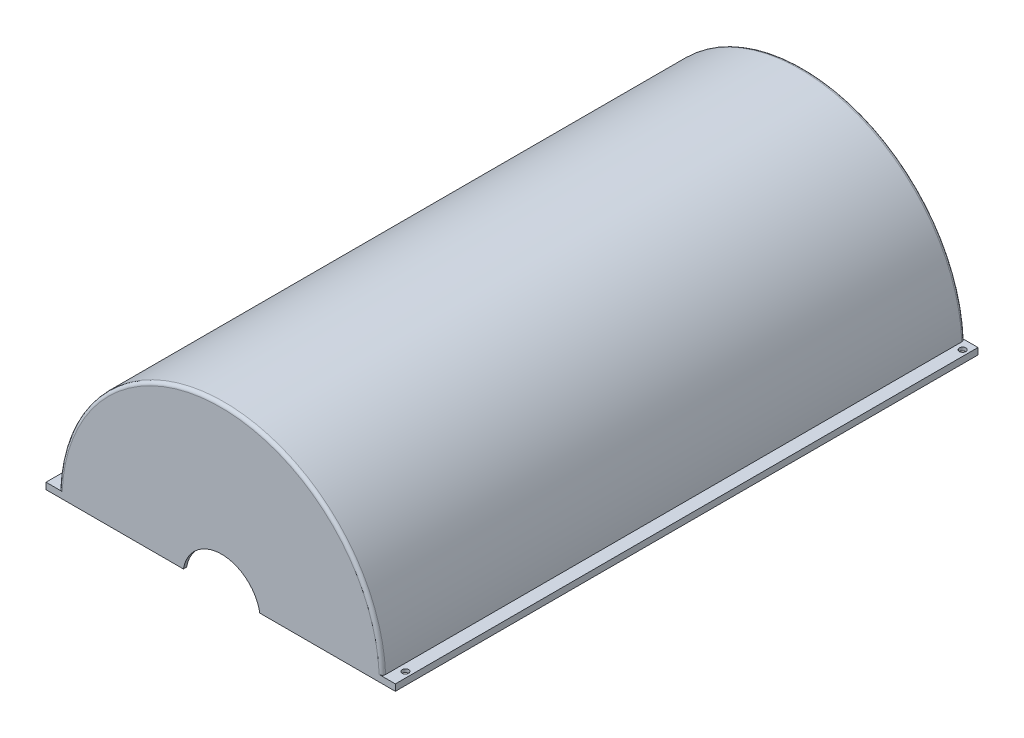
ISO-10303-21;
HEADER;
FILE_DESCRIPTION(('STEP AP214'),'2;1');
FILE_NAME('part.step','',(''),(''),'','','');
FILE_SCHEMA(('AUTOMOTIVE_DESIGN { 1 0 10303 214 1 1 1 1 }'));
ENDSEC;
DATA;
#1=APPLICATION_CONTEXT('core data for automotive mechanical design processes');
#2=APPLICATION_PROTOCOL_DEFINITION('international standard','automotive_design',2000,#1);
#3=PRODUCT_CONTEXT('',#1,'mechanical');
#4=PRODUCT('Part','Part','',(#3));
#5=PRODUCT_RELATED_PRODUCT_CATEGORY('part','',(#4));
#6=PRODUCT_DEFINITION_FORMATION('','',#4);
#7=PRODUCT_DEFINITION_CONTEXT('part definition',#1,'design');
#8=PRODUCT_DEFINITION('design','',#6,#7);
#9=PRODUCT_DEFINITION_SHAPE('','',#8);
#10=(LENGTH_UNIT() NAMED_UNIT(*) SI_UNIT(.MILLI.,.METRE.));
#11=(NAMED_UNIT(*) PLANE_ANGLE_UNIT() SI_UNIT($,.RADIAN.));
#12=(NAMED_UNIT(*) SI_UNIT($,.STERADIAN.) SOLID_ANGLE_UNIT());
#13=UNCERTAINTY_MEASURE_WITH_UNIT(LENGTH_MEASURE(1.E-05),#10,'distance_accuracy_value','');
#14=(GEOMETRIC_REPRESENTATION_CONTEXT(3) GLOBAL_UNCERTAINTY_ASSIGNED_CONTEXT((#13)) GLOBAL_UNIT_ASSIGNED_CONTEXT((#10,
#11,#12)) REPRESENTATION_CONTEXT('',''));
#15=CARTESIAN_POINT('',(0.,0.,0.));
#16=DIRECTION('',(0.,0.,1.));
#17=DIRECTION('',(1.,0.,0.));
#18=AXIS2_PLACEMENT_3D('',#15,#16,#17);
#19=CARTESIAN_POINT('',(1029.59983987187,0.,1800.));
#20=DIRECTION('',(-1.,0.,0.));
#21=DIRECTION('',(0.,0.,1.));
#22=AXIS2_PLACEMENT_3D('',#19,#20,#21);
#23=PLANE('',#22);
#24=DIRECTION('',(0.,1.,0.));
#25=VECTOR('',#24,1.);
#26=CARTESIAN_POINT('',(1029.59983987187,0.,35.9692352263382));
#27=LINE('',#26,#25);
#28=CARTESIAN_POINT('',(1029.59983987187,0.,35.9692352263382));
#29=VERTEX_POINT('',#28);
#30=CARTESIAN_POINT('',(1029.59983987187,10.,35.9692352263382));
#31=VERTEX_POINT('',#30);
#32=EDGE_CURVE('E47',#29,#31,#27,.T.);
#33=ORIENTED_EDGE('',*,*,#32,.F.);
#34=DIRECTION('',(0.,0.,-1.));
#35=VECTOR('',#34,1.);
#36=CARTESIAN_POINT('',(1029.59983987187,0.,1800.));
#37=LINE('',#36,#35);
#38=CARTESIAN_POINT('',(1029.59983987187,0.,1744.92903601317));
#39=VERTEX_POINT('',#38);
#40=EDGE_CURVE('E217',#39,#29,#37,.T.);
#41=ORIENTED_EDGE('',*,*,#40,.F.);
#42=DIRECTION('',(0.,1.,0.));
#43=VECTOR('',#42,1.);
#44=CARTESIAN_POINT('',(1029.59983987187,0.,1744.92903601317));
#45=LINE('',#44,#43);
#46=CARTESIAN_POINT('',(1029.59983987187,10.,1744.92903601317));
#47=VERTEX_POINT('',#46);
#48=EDGE_CURVE('E195',#47,#39,#45,.F.);
#49=ORIENTED_EDGE('',*,*,#48,.F.);
#50=DIRECTION('',(0.,0.,-1.));
#51=VECTOR('',#50,1.);
#52=CARTESIAN_POINT('',(1029.59983987187,10.,1800.));
#53=LINE('',#52,#51);
#54=EDGE_CURVE('E229',#47,#31,#53,.T.);
#55=ORIENTED_EDGE('',*,*,#54,.T.);
#56=EDGE_LOOP('',(#33,#41,#49,#55));
#57=FACE_BOUND('',#56,.T.);
#58=ADVANCED_FACE('F32',(#57),#23,.T.);
#59=DIRECTION('',(0.,1.,0.));
#60=VECTOR('',#59,1.);
#61=CARTESIAN_POINT('',(1029.59983987187,0.,1757.48844468544));
#62=LINE('',#61,#60);
#63=CARTESIAN_POINT('',(1029.59983987187,0.,1757.48844468544));
#64=VERTEX_POINT('',#63);
#65=CARTESIAN_POINT('',(1029.59983987187,10.,1757.48844468544));
#66=VERTEX_POINT('',#65);
#67=EDGE_CURVE('E55',#64,#66,#62,.T.);
#68=ORIENTED_EDGE('',*,*,#67,.F.);
#69=CARTESIAN_POINT('',(1029.59983987187,0.,1790.));
#70=VERTEX_POINT('',#69);
#71=EDGE_CURVE('E207',#70,#64,#37,.T.);
#72=ORIENTED_EDGE('',*,*,#71,.F.);
#73=DIRECTION('',(0.,1.,0.));
#74=VECTOR('',#73,1.);
#75=CARTESIAN_POINT('',(1029.59983987187,0.,1790.));
#76=LINE('',#75,#74);
#77=CARTESIAN_POINT('',(1029.59983987187,10.,1790.));
#78=VERTEX_POINT('',#77);
#79=EDGE_CURVE('E248',#70,#78,#76,.T.);
#80=ORIENTED_EDGE('',*,*,#79,.T.);
#81=EDGE_CURVE('E210',#78,#66,#53,.T.);
#82=ORIENTED_EDGE('',*,*,#81,.T.);
#83=EDGE_LOOP('',(#68,#72,#80,#82));
#84=FACE_BOUND('',#83,.T.);
#85=ADVANCED_FACE('F206',(#84),#23,.T.);
#86=CARTESIAN_POINT('',(500.,0.,10.));
#87=DIRECTION('',(0.,0.,1.));
#88=DIRECTION('',(1.,0.,0.));
#89=AXIS2_PLACEMENT_3D('',#86,#87,#88);
#90=PLANE('',#89);
#91=DIRECTION('',(0.,1.,0.));
#92=VECTOR('',#91,1.);
#93=CARTESIAN_POINT('',(-15.7632729166261,0.,10.));
#94=LINE('',#93,#92);
#95=CARTESIAN_POINT('',(-15.7632729166261,0.,10.));
#96=VERTEX_POINT('',#95);
#97=CARTESIAN_POINT('',(-15.7632729166261,10.,10.));
#98=VERTEX_POINT('',#97);
#99=EDGE_CURVE('E275',#96,#98,#94,.T.);
#100=ORIENTED_EDGE('',*,*,#99,.F.);
#101=DIRECTION('',(1.,0.,0.));
#102=VECTOR('',#101,1.);
#103=CARTESIAN_POINT('',(0.,0.,10.));
#104=LINE('',#103,#102);
#105=CARTESIAN_POINT('',(384.757529665463,0.,10.));
#106=VERTEX_POINT('',#105);
#107=EDGE_CURVE('E221',#96,#106,#104,.T.);
#108=ORIENTED_EDGE('',*,*,#107,.T.);
#109=CARTESIAN_POINT('',(502.844648307318,-21.3408624676775,10.));
#110=DIRECTION('',(0.,0.,1.));
#111=DIRECTION('',(1.,0.,0.));
#112=AXIS2_PLACEMENT_3D('',#109,#110,#111);
#113=CIRCLE('',#112,120.);
#114=CARTESIAN_POINT('',(620.931766949174,0.,10.));
#115=VERTEX_POINT('',#114);
#116=EDGE_CURVE('E410',#106,#115,#113,.F.);
#117=ORIENTED_EDGE('',*,*,#116,.T.);
#118=DIRECTION('',(1.,0.,0.));
#119=VECTOR('',#118,1.);
#120=CARTESIAN_POINT('',(620.931766949174,0.,10.));
#121=LINE('',#120,#119);
#122=CARTESIAN_POINT('',(1029.59983987187,0.,10.));
#123=VERTEX_POINT('',#122);
#124=EDGE_CURVE('E406',#115,#123,#121,.T.);
#125=ORIENTED_EDGE('',*,*,#124,.T.);
#126=DIRECTION('',(0.,1.,0.));
#127=VECTOR('',#126,1.);
#128=CARTESIAN_POINT('',(1029.59983987187,0.,10.));
#129=LINE('',#128,#127);
#130=CARTESIAN_POINT('',(1029.59983987187,10.,10.));
#131=VERTEX_POINT('',#130);
#132=EDGE_CURVE('E262',#123,#131,#129,.T.);
#133=ORIENTED_EDGE('',*,*,#132,.T.);
#134=DIRECTION('',(-1.,0.,0.));
#135=VECTOR('',#134,1.);
#136=CARTESIAN_POINT('',(1039.59983987187,10.,10.));
#137=LINE('',#136,#135);
#138=CARTESIAN_POINT('',(989.897948556636,10.,10.));
#139=VERTEX_POINT('',#138);
#140=EDGE_CURVE('E261',#131,#139,#137,.T.);
#141=ORIENTED_EDGE('',*,*,#140,.T.);
#142=CARTESIAN_POINT('',(500.,0.,10.));
#143=DIRECTION('',(0.,0.,1.));
#144=DIRECTION('',(1.,0.,0.));
#145=AXIS2_PLACEMENT_3D('',#142,#143,#144);
#146=CIRCLE('',#145,490.);
#147=CARTESIAN_POINT('',(10.1020514433644,10.,10.));
#148=VERTEX_POINT('',#147);
#149=EDGE_CURVE('E216',#139,#148,#146,.T.);
#150=ORIENTED_EDGE('',*,*,#149,.T.);
#151=DIRECTION('',(-1.,0.,0.));
#152=VECTOR('',#151,1.);
#153=CARTESIAN_POINT('',(-39.5998398718718,10.,10.));
#154=LINE('',#153,#152);
#155=EDGE_CURVE('E401',#148,#98,#154,.T.);
#156=ORIENTED_EDGE('',*,*,#155,.T.);
#157=EDGE_LOOP('',(#100,#108,#117,#125,#133,#141,#150,#156));
#158=FACE_BOUND('',#157,.T.);
#159=ADVANCED_FACE('F363',(#158),#90,.T.);
#160=CARTESIAN_POINT('',(0.,0.,1800.));
#161=DIRECTION('',(0.,1.,0.));
#162=DIRECTION('',(0.,0.,1.));
#163=AXIS2_PLACEMENT_3D('',#160,#161,#162);
#164=PLANE('',#163);
#165=ORIENTED_EDGE('',*,*,#107,.F.);
#166=CARTESIAN_POINT('',(-18.2357193018489,0.,19.689530890203));
#167=DIRECTION('',(0.,1.,0.));
#168=DIRECTION('',(-1.,0.,0.));
#169=AXIS2_PLACEMENT_3D('',#166,#167,#168);
#170=CIRCLE('',#169,10.);
#171=CARTESIAN_POINT('',(-20.7081656870717,0.,10.));
#172=VERTEX_POINT('',#171);
#173=EDGE_CURVE('E280',#96,#172,#170,.T.);
#174=ORIENTED_EDGE('',*,*,#173,.T.);
#175=CARTESIAN_POINT('',(-29.5998398718718,0.,10.));
#176=VERTEX_POINT('',#175);
#177=EDGE_CURVE('E411',#176,#172,#104,.T.);
#178=ORIENTED_EDGE('',*,*,#177,.F.);
#179=DIRECTION('',(0.,0.,-1.));
#180=VECTOR('',#179,1.);
#181=CARTESIAN_POINT('',(-29.5998398718718,0.,1800.));
#182=LINE('',#181,#180);
#183=CARTESIAN_POINT('',(-29.5998398718718,0.,1790.));
#184=VERTEX_POINT('',#183);
#185=EDGE_CURVE('E260',#184,#176,#182,.T.);
#186=ORIENTED_EDGE('',*,*,#185,.F.);
#187=DIRECTION('',(1.,0.,0.));
#188=VECTOR('',#187,1.);
#189=CARTESIAN_POINT('',(0.,0.,1790.));
#190=LINE('',#189,#188);
#191=CARTESIAN_POINT('',(384.757529665463,0.,1790.));
#192=VERTEX_POINT('',#191);
#193=EDGE_CURVE('E405',#184,#192,#190,.T.);
#194=ORIENTED_EDGE('',*,*,#193,.T.);
#195=DIRECTION('',(0.,0.,-1.));
#196=VECTOR('',#195,1.);
#197=CARTESIAN_POINT('',(384.757529665463,0.,1800.));
#198=LINE('',#197,#196);
#199=CARTESIAN_POINT('',(384.757529665463,0.,1800.));
#200=VERTEX_POINT('',#199);
#201=EDGE_CURVE('E439',#200,#192,#198,.T.);
#202=ORIENTED_EDGE('',*,*,#201,.F.);
#203=DIRECTION('',(1.,0.,0.));
#204=VECTOR('',#203,1.);
#205=CARTESIAN_POINT('',(0.,0.,1800.));
#206=LINE('',#205,#204);
#207=CARTESIAN_POINT('',(-39.5998398718718,0.,1800.));
#208=VERTEX_POINT('',#207);
#209=EDGE_CURVE('E499',#208,#200,#206,.T.);
#210=ORIENTED_EDGE('',*,*,#209,.F.);
#211=DIRECTION('',(0.,0.,-1.));
#212=VECTOR('',#211,1.);
#213=CARTESIAN_POINT('',(-39.5998398718718,0.,1800.));
#214=LINE('',#213,#212);
#215=CARTESIAN_POINT('',(-39.5998398718718,0.,0.));
#216=VERTEX_POINT('',#215);
#217=EDGE_CURVE('E478',#208,#216,#214,.T.);
#218=ORIENTED_EDGE('',*,*,#217,.T.);
#219=DIRECTION('',(1.,0.,0.));
#220=VECTOR('',#219,1.);
#221=CARTESIAN_POINT('',(0.,0.,0.));
#222=LINE('',#221,#220);
#223=CARTESIAN_POINT('',(384.757529665463,0.,0.));
#224=VERTEX_POINT('',#223);
#225=EDGE_CURVE('E437',#216,#224,#222,.T.);
#226=ORIENTED_EDGE('',*,*,#225,.T.);
#227=EDGE_CURVE('E433',#106,#224,#198,.T.);
#228=ORIENTED_EDGE('',*,*,#227,.F.);
#229=EDGE_LOOP('',(#165,#174,#178,#186,#194,#202,#210,#218,#226,#228));
#230=FACE_BOUND('',#229,.T.);
#231=ADVANCED_FACE('F359',(#230),#164,.F.);
#232=CARTESIAN_POINT('',(502.844648307318,-21.3408624676775,1800.));
#233=DIRECTION('',(0.,0.,-1.));
#234=DIRECTION('',(-1.,0.,0.));
#235=AXIS2_PLACEMENT_3D('',#232,#233,#234);
#236=CYLINDRICAL_SURFACE('',#235,120.);
#237=ORIENTED_EDGE('',*,*,#116,.F.);
#238=ORIENTED_EDGE('',*,*,#227,.T.);
#239=CARTESIAN_POINT('',(502.844648307318,-21.3408624676775,0.));
#240=DIRECTION('',(0.,0.,-1.));
#241=DIRECTION('',(-1.,0.,0.));
#242=AXIS2_PLACEMENT_3D('',#239,#240,#241);
#243=CIRCLE('',#242,120.);
#244=CARTESIAN_POINT('',(620.931766949174,0.,0.));
#245=VERTEX_POINT('',#244);
#246=EDGE_CURVE('E507',#224,#245,#243,.T.);
#247=ORIENTED_EDGE('',*,*,#246,.T.);
#248=DIRECTION('',(0.,0.,-1.));
#249=VECTOR('',#248,1.);
#250=CARTESIAN_POINT('',(620.931766949174,0.,1800.));
#251=LINE('',#250,#249);
#252=EDGE_CURVE('E435',#115,#245,#251,.T.);
#253=ORIENTED_EDGE('',*,*,#252,.F.);
#254=EDGE_LOOP('',(#237,#238,#247,#253));
#255=FACE_BOUND('',#254,.T.);
#256=ADVANCED_FACE('F362',(#255),#236,.F.);
#257=CARTESIAN_POINT('',(620.931766949174,0.,1800.));
#258=DIRECTION('',(0.,1.,0.));
#259=DIRECTION('',(0.,0.,1.));
#260=AXIS2_PLACEMENT_3D('',#257,#258,#259);
#261=PLANE('',#260);
#262=ORIENTED_EDGE('',*,*,#40,.T.);
#263=CARTESIAN_POINT('',(1021.81746790372,0.,29.689530890203));
#264=DIRECTION('',(0.,1.,0.));
#265=DIRECTION('',(-1.,0.,0.));
#266=AXIS2_PLACEMENT_3D('',#263,#264,#265);
#267=CIRCLE('',#266,10.0000000000001);
#268=CARTESIAN_POINT('',(1029.59983987187,0.,23.4098265540678));
#269=VERTEX_POINT('',#268);
#270=EDGE_CURVE('E297',#29,#269,#267,.T.);
#271=ORIENTED_EDGE('',*,*,#270,.T.);
#272=EDGE_CURVE('E219',#269,#123,#37,.T.);
#273=ORIENTED_EDGE('',*,*,#272,.T.);
#274=ORIENTED_EDGE('',*,*,#124,.F.);
#275=ORIENTED_EDGE('',*,*,#252,.T.);
#276=DIRECTION('',(1.,0.,0.));
#277=VECTOR('',#276,1.);
#278=CARTESIAN_POINT('',(620.931766949174,0.,0.));
#279=LINE('',#278,#277);
#280=CARTESIAN_POINT('',(1039.59983987187,0.,0.));
#281=VERTEX_POINT('',#280);
#282=EDGE_CURVE('E502',#245,#281,#279,.T.);
#283=ORIENTED_EDGE('',*,*,#282,.T.);
#284=DIRECTION('',(0.,0.,-1.));
#285=VECTOR('',#284,1.);
#286=CARTESIAN_POINT('',(1039.59983987187,0.,1800.));
#287=LINE('',#286,#285);
#288=CARTESIAN_POINT('',(1039.59983987187,0.,1800.));
#289=VERTEX_POINT('',#288);
#290=EDGE_CURVE('E496',#289,#281,#287,.T.);
#291=ORIENTED_EDGE('',*,*,#290,.F.);
#292=DIRECTION('',(1.,0.,0.));
#293=VECTOR('',#292,1.);
#294=CARTESIAN_POINT('',(620.931766949174,0.,1800.));
#295=LINE('',#294,#293);
#296=CARTESIAN_POINT('',(620.931766949174,0.,1800.));
#297=VERTEX_POINT('',#296);
#298=EDGE_CURVE('E504',#297,#289,#295,.T.);
#299=ORIENTED_EDGE('',*,*,#298,.F.);
#300=CARTESIAN_POINT('',(620.931766949174,0.,1790.));
#301=VERTEX_POINT('',#300);
#302=EDGE_CURVE('E440',#297,#301,#251,.T.);
#303=ORIENTED_EDGE('',*,*,#302,.T.);
#304=DIRECTION('',(1.,0.,0.));
#305=VECTOR('',#304,1.);
#306=CARTESIAN_POINT('',(620.931766949174,0.,1790.));
#307=LINE('',#306,#305);
#308=EDGE_CURVE('E215',#301,#70,#307,.T.);
#309=ORIENTED_EDGE('',*,*,#308,.T.);
#310=ORIENTED_EDGE('',*,*,#71,.T.);
#311=CARTESIAN_POINT('',(1021.81746790372,0.,1751.20874034931));
#312=DIRECTION('',(0.,1.,0.));
#313=DIRECTION('',(-1.,0.,0.));
#314=AXIS2_PLACEMENT_3D('',#311,#312,#313);
#315=CIRCLE('',#314,10.0000000000001);
#316=EDGE_CURVE('E191',#64,#39,#315,.T.);
#317=ORIENTED_EDGE('',*,*,#316,.T.);
#318=EDGE_LOOP('',(#262,#271,#273,#274,#275,#283,#291,#299,#303,#309,#310,#317));
#319=FACE_BOUND('',#318,.T.);
#320=ADVANCED_FACE('F213',(#319),#261,.F.);
#321=CARTESIAN_POINT('',(500.,0.,1800.));
#322=DIRECTION('',(0.,0.,-1.));
#323=DIRECTION('',(-1.,0.,0.));
#324=AXIS2_PLACEMENT_3D('',#321,#322,#323);
#325=CYLINDRICAL_SURFACE('',#324,500.);
#326=DIRECTION('',(0.,0.,-1.));
#327=VECTOR('',#326,1.);
#328=CARTESIAN_POINT('',(999.599839871872,20.,1800.));
#329=LINE('',#328,#327);
#330=CARTESIAN_POINT('',(999.599839871872,20.,1790.));
#331=VERTEX_POINT('',#330);
#332=CARTESIAN_POINT('',(999.599839871872,20.,10.));
#333=VERTEX_POINT('',#332);
#334=EDGE_CURVE('E488',#331,#333,#329,.T.);
#335=ORIENTED_EDGE('',*,*,#334,.T.);
#336=CARTESIAN_POINT('',(500.,0.,10.));
#337=DIRECTION('',(0.,0.,1.));
#338=DIRECTION('',(1.,0.,0.));
#339=AXIS2_PLACEMENT_3D('',#336,#337,#338);
#340=CIRCLE('',#339,500.);
#341=CARTESIAN_POINT('',(0.4001601281281,20.,10.));
#342=VERTEX_POINT('',#341);
#343=EDGE_CURVE('E448',#333,#342,#340,.T.);
#344=ORIENTED_EDGE('',*,*,#343,.T.);
#345=DIRECTION('',(0.,0.,-1.));
#346=VECTOR('',#345,1.);
#347=CARTESIAN_POINT('',(0.4001601281281,20.,1800.));
#348=LINE('',#347,#346);
#349=CARTESIAN_POINT('',(0.4001601281281,20.,1790.));
#350=VERTEX_POINT('',#349);
#351=EDGE_CURVE('E462',#350,#342,#348,.T.);
#352=ORIENTED_EDGE('',*,*,#351,.F.);
#353=CARTESIAN_POINT('',(500.,0.,1790.));
#354=DIRECTION('',(0.,0.,1.));
#355=DIRECTION('',(1.,0.,0.));
#356=AXIS2_PLACEMENT_3D('',#353,#354,#355);
#357=CIRCLE('',#356,500.);
#358=EDGE_CURVE('E443',#350,#331,#357,.F.);
#359=ORIENTED_EDGE('',*,*,#358,.T.);
#360=EDGE_LOOP('',(#335,#344,#352,#359));
#361=FACE_BOUND('',#360,.T.);
#362=ADVANCED_FACE('F353',(#361),#325,.T.);
#363=ORIENTED_EDGE('',*,*,#201,.T.);
#364=CARTESIAN_POINT('',(502.844648307318,-21.3408624676775,1790.));
#365=DIRECTION('',(0.,0.,1.));
#366=DIRECTION('',(1.,0.,0.));
#367=AXIS2_PLACEMENT_3D('',#364,#365,#366);
#368=CIRCLE('',#367,120.);
#369=EDGE_CURVE('E408',#192,#301,#368,.F.);
#370=ORIENTED_EDGE('',*,*,#369,.T.);
#371=ORIENTED_EDGE('',*,*,#302,.F.);
#372=CARTESIAN_POINT('',(502.844648307318,-21.3408624676775,1800.));
#373=DIRECTION('',(0.,0.,-1.));
#374=DIRECTION('',(-1.,0.,0.));
#375=AXIS2_PLACEMENT_3D('',#372,#373,#374);
#376=CIRCLE('',#375,120.);
#377=EDGE_CURVE('E501',#200,#297,#376,.T.);
#378=ORIENTED_EDGE('',*,*,#377,.F.);
#379=EDGE_LOOP('',(#363,#370,#371,#378));
#380=FACE_BOUND('',#379,.T.);
#381=ADVANCED_FACE('F357',(#380),#236,.F.);
#382=CARTESIAN_POINT('',(500.,0.,1800.));
#383=DIRECTION('',(0.,0.,1.));
#384=DIRECTION('',(1.,0.,0.));
#385=AXIS2_PLACEMENT_3D('',#382,#383,#384);
#386=PLANE('',#385);
#387=CARTESIAN_POINT('',(500.,0.,1800.));
#388=DIRECTION('',(0.,0.,1.));
#389=DIRECTION('',(1.,0.,0.));
#390=AXIS2_PLACEMENT_3D('',#387,#388,#389);
#391=CIRCLE('',#390,490.);
#392=CARTESIAN_POINT('',(989.591666595746,20.,1800.));
#393=VERTEX_POINT('',#392);
#394=CARTESIAN_POINT('',(10.4083334042541,20.,1800.));
#395=VERTEX_POINT('',#394);
#396=EDGE_CURVE('E453',#393,#395,#391,.T.);
#397=ORIENTED_EDGE('',*,*,#396,.T.);
#398=DIRECTION('',(-1.,0.,0.));
#399=VECTOR('',#398,1.);
#400=CARTESIAN_POINT('',(-39.5998398718718,20.,1800.));
#401=LINE('',#400,#399);
#402=CARTESIAN_POINT('',(-39.5998398718718,20.,1800.));
#403=VERTEX_POINT('',#402);
#404=EDGE_CURVE('E472',#395,#403,#401,.T.);
#405=ORIENTED_EDGE('',*,*,#404,.T.);
#406=DIRECTION('',(0.,-1.,0.));
#407=VECTOR('',#406,1.);
#408=CARTESIAN_POINT('',(-39.5998398718718,0.,1800.));
#409=LINE('',#408,#407);
#410=EDGE_CURVE('E475',#403,#208,#409,.T.);
#411=ORIENTED_EDGE('',*,*,#410,.T.);
#412=ORIENTED_EDGE('',*,*,#209,.T.);
#413=ORIENTED_EDGE('',*,*,#377,.T.);
#414=ORIENTED_EDGE('',*,*,#298,.T.);
#415=DIRECTION('',(0.,1.,0.));
#416=VECTOR('',#415,1.);
#417=CARTESIAN_POINT('',(1039.59983987187,0.,1800.));
#418=LINE('',#417,#416);
#419=CARTESIAN_POINT('',(1039.59983987187,20.,1800.));
#420=VERTEX_POINT('',#419);
#421=EDGE_CURVE('E484',#289,#420,#418,.T.);
#422=ORIENTED_EDGE('',*,*,#421,.T.);
#423=DIRECTION('',(-1.,0.,0.));
#424=VECTOR('',#423,1.);
#425=CARTESIAN_POINT('',(1039.59983987187,20.,1800.));
#426=LINE('',#425,#424);
#427=EDGE_CURVE('E486',#420,#393,#426,.T.);
#428=ORIENTED_EDGE('',*,*,#427,.T.);
#429=EDGE_LOOP('',(#397,#405,#411,#412,#413,#414,#422,#428));
#430=FACE_BOUND('',#429,.T.);
#431=ADVANCED_FACE('F367',(#430),#386,.T.);
#432=CARTESIAN_POINT('',(500.,0.,0.));
#433=DIRECTION('',(0.,0.,1.));
#434=DIRECTION('',(1.,0.,0.));
#435=AXIS2_PLACEMENT_3D('',#432,#433,#434);
#436=PLANE('',#435);
#437=DIRECTION('',(-1.,0.,0.));
#438=VECTOR('',#437,1.);
#439=CARTESIAN_POINT('',(-39.5998398718718,20.,0.));
#440=LINE('',#439,#438);
#441=CARTESIAN_POINT('',(10.4083334042541,20.,0.));
#442=VERTEX_POINT('',#441);
#443=CARTESIAN_POINT('',(-39.5998398718718,20.,0.));
#444=VERTEX_POINT('',#443);
#445=EDGE_CURVE('E459',#442,#444,#440,.T.);
#446=ORIENTED_EDGE('',*,*,#445,.F.);
#447=CARTESIAN_POINT('',(500.,0.,0.));
#448=DIRECTION('',(0.,0.,1.));
#449=DIRECTION('',(1.,0.,0.));
#450=AXIS2_PLACEMENT_3D('',#447,#448,#449);
#451=CIRCLE('',#450,490.);
#452=CARTESIAN_POINT('',(989.591666595746,20.,0.));
#453=VERTEX_POINT('',#452);
#454=EDGE_CURVE('E451',#442,#453,#451,.F.);
#455=ORIENTED_EDGE('',*,*,#454,.T.);
#456=DIRECTION('',(-1.,0.,0.));
#457=VECTOR('',#456,1.);
#458=CARTESIAN_POINT('',(1039.59983987187,20.,0.));
#459=LINE('',#458,#457);
#460=CARTESIAN_POINT('',(1039.59983987187,20.,0.));
#461=VERTEX_POINT('',#460);
#462=EDGE_CURVE('E467',#461,#453,#459,.T.);
#463=ORIENTED_EDGE('',*,*,#462,.F.);
#464=DIRECTION('',(0.,1.,0.));
#465=VECTOR('',#464,1.);
#466=CARTESIAN_POINT('',(1039.59983987187,0.,0.));
#467=LINE('',#466,#465);
#468=EDGE_CURVE('E483',#281,#461,#467,.T.);
#469=ORIENTED_EDGE('',*,*,#468,.F.);
#470=ORIENTED_EDGE('',*,*,#282,.F.);
#471=ORIENTED_EDGE('',*,*,#246,.F.);
#472=ORIENTED_EDGE('',*,*,#225,.F.);
#473=DIRECTION('',(0.,-1.,0.));
#474=VECTOR('',#473,1.);
#475=CARTESIAN_POINT('',(-39.5998398718718,0.,0.));
#476=LINE('',#475,#474);
#477=EDGE_CURVE('E470',#444,#216,#476,.T.);
#478=ORIENTED_EDGE('',*,*,#477,.F.);
#479=EDGE_LOOP('',(#446,#455,#463,#469,#470,#471,#472,#478));
#480=FACE_BOUND('',#479,.T.);
#481=ADVANCED_FACE('F371',(#480),#436,.F.);
#482=CARTESIAN_POINT('',(1039.59983987187,0.,1800.));
#483=DIRECTION('',(-1.,0.,0.));
#484=DIRECTION('',(0.,0.,1.));
#485=AXIS2_PLACEMENT_3D('',#482,#483,#484);
#486=PLANE('',#485);
#487=ORIENTED_EDGE('',*,*,#468,.T.);
#488=DIRECTION('',(0.,0.,-1.));
#489=VECTOR('',#488,1.);
#490=CARTESIAN_POINT('',(1039.59983987187,20.,1800.));
#491=LINE('',#490,#489);
#492=EDGE_CURVE('E493',#420,#461,#491,.T.);
#493=ORIENTED_EDGE('',*,*,#492,.F.);
#494=ORIENTED_EDGE('',*,*,#421,.F.);
#495=ORIENTED_EDGE('',*,*,#290,.T.);
#496=EDGE_LOOP('',(#487,#493,#494,#495));
#497=FACE_BOUND('',#496,.T.);
#498=ADVANCED_FACE('F332',(#497),#486,.F.);
#499=CARTESIAN_POINT('',(1039.59983987187,20.,1800.));
#500=DIRECTION('',(0.,-1.,0.));
#501=DIRECTION('',(1.,0.,0.));
#502=AXIS2_PLACEMENT_3D('',#499,#500,#501);
#503=PLANE('',#502);
#504=CARTESIAN_POINT('',(1021.81746790372,19.9999999999999,29.689530890203));
#505=DIRECTION('',(0.,1.,0.));
#506=DIRECTION('',(-1.,0.,0.));
#507=AXIS2_PLACEMENT_3D('',#504,#505,#506);
#508=CIRCLE('',#507,10.0000000000001);
#509=CARTESIAN_POINT('',(1011.81746790372,19.9999999999999,29.689530890203));
#510=VERTEX_POINT('',#509);
#511=EDGE_CURVE('E200',#510,#510,#508,.T.);
#512=ORIENTED_EDGE('',*,*,#511,.F.);
#513=EDGE_LOOP('',(#512));
#514=FACE_BOUND('',#513,.T.);
#515=CARTESIAN_POINT('',(1021.81746790372,19.9999999999999,1751.20874034931));
#516=DIRECTION('',(0.,1.,0.));
#517=DIRECTION('',(-1.,0.,0.));
#518=AXIS2_PLACEMENT_3D('',#515,#516,#517);
#519=CIRCLE('',#518,10.0000000000001);
#520=CARTESIAN_POINT('',(1011.81746790372,19.9999999999999,1751.20874034931));
#521=VERTEX_POINT('',#520);
#522=EDGE_CURVE('E201',#521,#521,#519,.T.);
#523=ORIENTED_EDGE('',*,*,#522,.F.);
#524=EDGE_LOOP('',(#523));
#525=FACE_BOUND('',#524,.T.);
#526=ORIENTED_EDGE('',*,*,#462,.T.);
#527=CARTESIAN_POINT('',(989.591666595746,20.,0.));
#528=CARTESIAN_POINT('',(989.87332638519,20.,-3.01228332000598E-05));
#529=CARTESIAN_POINT('',(990.15498193208,20.,0.0118787481991323));
#530=CARTESIAN_POINT('',(990.716279253955,20.,0.0593571789910254));
#531=CARTESIAN_POINT('',(990.995921121307,20.,0.0949256464168403));
#532=CARTESIAN_POINT('',(991.551009130798,20.,0.189471425184683));
#533=CARTESIAN_POINT('',(991.826458191694,20.,0.248431598770848));
#534=CARTESIAN_POINT('',(992.371410180892,20.,0.38933413843634));
#535=CARTESIAN_POINT('',(992.640913183872,20.,0.471276215702702));
#536=CARTESIAN_POINT('',(993.172190350373,20.,0.657611482848551));
#537=CARTESIAN_POINT('',(993.433960689874,20.,0.762015576228788));
#538=CARTESIAN_POINT('',(993.947777699333,20.,0.992513741715076));
#539=CARTESIAN_POINT('',(994.199824167757,20.,1.11860826307686));
#540=CARTESIAN_POINT('',(994.692345592563,20.,1.39156639968591));
#541=CARTESIAN_POINT('',(994.932822741624,20.,1.53842605846714));
#542=CARTESIAN_POINT('',(995.400542153176,20.,1.85189050188693));
#543=CARTESIAN_POINT('',(995.627784491727,20.,2.01849517303592));
#544=CARTESIAN_POINT('',(996.06732998014,20.,2.37019984210933));
#545=CARTESIAN_POINT('',(996.279638900216,20.,2.55529262864948));
#546=CARTESIAN_POINT('',(996.687900645393,20.,2.9427140526937));
#547=CARTESIAN_POINT('',(996.88385348194,20.,3.14504267813466));
#548=CARTESIAN_POINT('',(997.258043003431,20.,3.56554198440223));
#549=CARTESIAN_POINT('',(997.436276073244,20.,3.78371588228515));
#550=CARTESIAN_POINT('',(997.773704587572,20.,4.23431424987274));
#551=CARTESIAN_POINT('',(997.932900337705,20.,4.4667384907176));
#552=CARTESIAN_POINT('',(998.231035541651,20.,4.94405354327489));
#553=CARTESIAN_POINT('',(998.369986325374,20.,5.1889372778035));
#554=CARTESIAN_POINT('',(998.626742569512,20.,5.68954173372557));
#555=CARTESIAN_POINT('',(998.74454839999,20.,5.94526226536502));
#556=CARTESIAN_POINT('',(998.958126197114,20.,6.46561543097089));
#557=CARTESIAN_POINT('',(999.053908465858,20.,6.73024383136442));
#558=CARTESIAN_POINT('',(999.222800742149,20.,7.26652896225174));
#559=CARTESIAN_POINT('',(999.295916248122,20.,7.53818397090439));
#560=CARTESIAN_POINT('',(999.437966473097,20.,8.17138740576445));
#561=CARTESIAN_POINT('',(999.49866693677,20.,8.53483612665284));
#562=CARTESIAN_POINT('',(999.559363521588,20.,9.08290965254294));
#563=CARTESIAN_POINT('',(999.574536684531,20.,9.26599081990059));
#564=CARTESIAN_POINT('',(999.594773671563,20.,9.63269975649481));
#565=CARTESIAN_POINT('',(999.599838119902,20.,9.81632749127745));
#566=CARTESIAN_POINT('',(999.599839871872,20.,10.));
#567=B_SPLINE_CURVE_WITH_KNOTS('',3,(#527,#528,#529,#530,#531,#532,#533,#534,#535,#536,#537,
#538,#539,#540,#541,#542,#543,#544,#545,#546,#547,#548,#549,#550,#551,#552,#553,#554,#555,#556,
#557,#558,#559,#560,#561,#562,#563,#564,#565,#566),.UNSPECIFIED.,.F.,.F.,(4,2,2,2,2,2,2,2,2,2,2,
2,2,2,2,2,2,2,2,4),(0.,0.844721754187906,1.6894045113437,2.53346955753293,3.37752399685466,
4.22198908483556,5.06647166562344,5.91079355999348,6.75511060164001,7.59909958967677,
8.44308798702235,9.28724822045703,10.1313949002693,10.9750673313973,11.8187249957899,
12.6619872107407,13.505044709638,14.6079444551709,15.1588368439868,15.7096952121332),.UNSPECIFIED.);
#568=EDGE_CURVE('E316',#453,#333,#567,.T.);
#569=ORIENTED_EDGE('',*,*,#568,.T.);
#570=ORIENTED_EDGE('',*,*,#334,.F.);
#571=CARTESIAN_POINT('',(999.599839871872,20.,1790.));
#572=CARTESIAN_POINT('',(999.59987025394,20.,1790.28109596905));
#573=CARTESIAN_POINT('',(999.587979413659,20.,1790.56218751331));
#574=CARTESIAN_POINT('',(999.540574776136,20.,1791.12235822186));
#575=CARTESIAN_POINT('',(999.505062149082,20.,1791.40143748515));
#576=CARTESIAN_POINT('',(999.410670104849,20.,1791.95539284976));
#577=CARTESIAN_POINT('',(999.351808881887,20.,1792.23027205115));
#578=CARTESIAN_POINT('',(999.21114982256,20.,1792.77409411788));
#579=CARTESIAN_POINT('',(999.129352259335,20.,1793.04303705388));
#580=CARTESIAN_POINT('',(998.943357648267,20.,1793.57320422674));
#581=CARTESIAN_POINT('',(998.839150129005,20.,1793.83442479007));
#582=CARTESIAN_POINT('',(998.609100238965,20.,1794.34716553676));
#583=CARTESIAN_POINT('',(998.483257401781,20.,1794.59868551084));
#584=CARTESIAN_POINT('',(998.210860377519,20.,1795.09018935176));
#585=CARTESIAN_POINT('',(998.064309900505,20.,1795.33017527478));
#586=CARTESIAN_POINT('',(997.7515258866,20.,1795.79695585264));
#587=CARTESIAN_POINT('',(997.585292449269,20.,1796.02375057421));
#588=CARTESIAN_POINT('',(997.234265481638,20.,1796.46261801201));
#589=CARTESIAN_POINT('',(997.049465611243,20.,1796.67468565713));
#590=CARTESIAN_POINT('',(996.662669090432,20.,1797.0825108997));
#591=CARTESIAN_POINT('',(996.460672427523,20.,1797.2782684853));
#592=CARTESIAN_POINT('',(996.040876722523,20.,1797.6521255671));
#593=CARTESIAN_POINT('',(995.82307447072,20.,1797.83022145919));
#594=CARTESIAN_POINT('',(995.373256668994,20.,1798.16744684854));
#595=CARTESIAN_POINT('',(995.1412413285,20.,1798.32657662517));
#596=CARTESIAN_POINT('',(994.664410921535,20.,1798.62489238665));
#597=CARTESIAN_POINT('',(994.419583664193,20.,1798.76405888704));
#598=CARTESIAN_POINT('',(993.919085824922,20.,1799.02127686949));
#599=CARTESIAN_POINT('',(993.663415414119,20.,1799.13932868461));
#600=CARTESIAN_POINT('',(993.143148858425,20.,1799.35343792784));
#601=CARTESIAN_POINT('',(992.878556776036,20.,1799.44950521552));
#602=CARTESIAN_POINT('',(992.342330939816,20.,1799.61901050932));
#603=CARTESIAN_POINT('',(992.070698880056,20.,1799.69245390573));
#604=CARTESIAN_POINT('',(991.434749781912,20.,1799.83594147159));
#605=CARTESIAN_POINT('',(991.068453352853,20.,1799.89746159127));
#606=CARTESIAN_POINT('',(990.516050586764,20.,1799.95897751524));
#607=CARTESIAN_POINT('',(990.331516809023,20.,1799.97435543392));
#608=CARTESIAN_POINT('',(989.961892793249,20.,1799.99486540648));
#609=CARTESIAN_POINT('',(989.776802592474,20.,1799.99999813171));
#610=CARTESIAN_POINT('',(989.591666595746,20.,1800.));
#611=B_SPLINE_CURVE_WITH_KNOTS('',3,(#571,#572,#573,#574,#575,#576,#577,#578,#579,#580,#581,
#582,#583,#584,#585,#586,#587,#588,#589,#590,#591,#592,#593,#594,#595,#596,#597,#598,#599,#600,
#601,#602,#603,#604,#605,#606,#607,#608,#609,#610),.UNSPECIFIED.,.F.,.F.,(4,2,2,2,2,2,2,2,2,2,2,
2,2,2,2,2,2,2,2,4),(0.,0.843030261822992,1.68601876428292,2.52835166067543,3.37067452643723,
4.21339183988466,5.05612732265668,5.89871200859549,6.74129243281923,7.58416156709617,
8.42703131366637,9.27007270717967,10.1131016815717,10.9569479461691,11.8007808981852,
12.6442346646599,13.487487316581,14.5991668946263,15.1544487376555,15.7096941935099),.UNSPECIFIED.);
#612=EDGE_CURVE('E305',#331,#393,#611,.T.);
#613=ORIENTED_EDGE('',*,*,#612,.T.);
#614=ORIENTED_EDGE('',*,*,#427,.F.);
#615=ORIENTED_EDGE('',*,*,#492,.T.);
#616=EDGE_LOOP('',(#526,#569,#570,#613,#614,#615));
#617=FACE_BOUND('',#616,.T.);
#618=ADVANCED_FACE('F327',(#514,#525,#617),#503,.F.);
#619=CARTESIAN_POINT('',(-39.5998398718718,20.,1800.));
#620=DIRECTION('',(0.,-1.,0.));
#621=DIRECTION('',(1.,0.,0.));
#622=AXIS2_PLACEMENT_3D('',#619,#620,#621);
#623=PLANE('',#622);
#624=CARTESIAN_POINT('',(-18.2357193018489,20.,1741.20874034931));
#625=DIRECTION('',(0.,1.,0.));
#626=DIRECTION('',(-1.,0.,0.));
#627=AXIS2_PLACEMENT_3D('',#624,#625,#626);
#628=CIRCLE('',#627,10.);
#629=CARTESIAN_POINT('',(-28.2357193018489,20.,1741.20874034931));
#630=VERTEX_POINT('',#629);
#631=EDGE_CURVE('E290',#630,#630,#628,.T.);
#632=ORIENTED_EDGE('',*,*,#631,.F.);
#633=EDGE_LOOP('',(#632));
#634=FACE_BOUND('',#633,.T.);
#635=CARTESIAN_POINT('',(-18.2357193018489,20.,19.689530890203));
#636=DIRECTION('',(0.,1.,0.));
#637=DIRECTION('',(-1.,0.,0.));
#638=AXIS2_PLACEMENT_3D('',#635,#636,#637);
#639=CIRCLE('',#638,10.);
#640=CARTESIAN_POINT('',(-28.2357193018489,20.,19.689530890203));
#641=VERTEX_POINT('',#640);
#642=EDGE_CURVE('E281',#641,#641,#639,.T.);
#643=ORIENTED_EDGE('',*,*,#642,.F.);
#644=EDGE_LOOP('',(#643));
#645=FACE_BOUND('',#644,.T.);
#646=ORIENTED_EDGE('',*,*,#445,.T.);
#647=DIRECTION('',(0.,0.,-1.));
#648=VECTOR('',#647,1.);
#649=CARTESIAN_POINT('',(-39.5998398718718,20.,1800.));
#650=LINE('',#649,#648);
#651=EDGE_CURVE('E480',#403,#444,#650,.T.);
#652=ORIENTED_EDGE('',*,*,#651,.F.);
#653=ORIENTED_EDGE('',*,*,#404,.F.);
#654=CARTESIAN_POINT('',(10.4083334042541,20.,1800.));
#655=CARTESIAN_POINT('',(10.1266736148102,20.,1800.00003012283));
#656=CARTESIAN_POINT('',(9.84501806792046,20.,1799.9881212518));
#657=CARTESIAN_POINT('',(9.2837207460454,20.,1799.94064282101));
#658=CARTESIAN_POINT('',(9.00407887869348,20.,1799.90507435358));
#659=CARTESIAN_POINT('',(8.4489908692022,20.,1799.81052857482));
#660=CARTESIAN_POINT('',(8.17354180830618,20.,1799.75156840123));
#661=CARTESIAN_POINT('',(7.62858981910782,20.,1799.61066586156));
#662=CARTESIAN_POINT('',(7.35908681612743,20.,1799.5287237843));
#663=CARTESIAN_POINT('',(6.82780964962649,20.,1799.34238851715));
#664=CARTESIAN_POINT('',(6.56603931012605,20.,1799.23798442377));
#665=CARTESIAN_POINT('',(6.05222230066693,20.,1799.00748625829));
#666=CARTESIAN_POINT('',(5.80017583224309,20.,1798.88139173692));
#667=CARTESIAN_POINT('',(5.30765440743649,20.,1798.60843360031));
#668=CARTESIAN_POINT('',(5.06717725837561,20.,1798.46157394153));
#669=CARTESIAN_POINT('',(4.59945784682356,20.,1798.14810949811));
#670=CARTESIAN_POINT('',(4.37221550827307,20.,1797.98150482696));
#671=CARTESIAN_POINT('',(3.93267001985993,20.,1797.62980015789));
#672=CARTESIAN_POINT('',(3.72036109978353,20.,1797.44470737135));
#673=CARTESIAN_POINT('',(3.31209935460732,20.,1797.05728594731));
#674=CARTESIAN_POINT('',(3.1161465180603,20.,1796.85495732187));
#675=CARTESIAN_POINT('',(2.74195699656863,20.,1796.4344580156));
#676=CARTESIAN_POINT('',(2.56372392675637,20.,1796.21628411771));
#677=CARTESIAN_POINT('',(2.22629541242808,20.,1795.76568575013));
#678=CARTESIAN_POINT('',(2.06709966229472,20.,1795.53326150928));
#679=CARTESIAN_POINT('',(1.76896445834882,20.,1795.05594645672));
#680=CARTESIAN_POINT('',(1.63001367462587,20.,1794.8110627222));
#681=CARTESIAN_POINT('',(1.37325743048785,20.,1794.31045826627));
#682=CARTESIAN_POINT('',(1.25545160001032,20.,1794.05473773464));
#683=CARTESIAN_POINT('',(1.04187380288547,20.,1793.53438456903));
#684=CARTESIAN_POINT('',(0.946091534141645,20.,1793.26975616864));
#685=CARTESIAN_POINT('',(0.777199257851156,20.,1792.73347103775));
#686=CARTESIAN_POINT('',(0.704083751877597,20.,1792.4618160291));
#687=CARTESIAN_POINT('',(0.562033526902983,20.,1791.82861259424));
#688=CARTESIAN_POINT('',(0.501333063229798,20.,1791.46516387335));
#689=CARTESIAN_POINT('',(0.440636478411642,20.,1790.91709034746));
#690=CARTESIAN_POINT('',(0.425463315469242,20.,1790.7340091801));
#691=CARTESIAN_POINT('',(0.405226328437591,20.,1790.36730024351));
#692=CARTESIAN_POINT('',(0.400161880098304,20.,1790.18367250872));
#693=CARTESIAN_POINT('',(0.400160128128099,20.,1790.));
#694=B_SPLINE_CURVE_WITH_KNOTS('',3,(#654,#655,#656,#657,#658,#659,#660,#661,#662,#663,#664,
#665,#666,#667,#668,#669,#670,#671,#672,#673,#674,#675,#676,#677,#678,#679,#680,#681,#682,#683,
#684,#685,#686,#687,#688,#689,#690,#691,#692,#693),.UNSPECIFIED.,.F.,.F.,(4,2,2,2,2,2,2,2,2,2,2,
2,2,2,2,2,2,2,2,4),(0.,0.844721754187904,1.68940451134358,2.53346955753299,3.37752399685465,
4.22198908483572,5.06647166562369,5.91079355999368,6.75511060163997,7.5990995896767,
8.44308798702231,9.28724822045707,10.1313949002693,10.9750673313975,11.8187249957896,
12.6619872107408,13.5050447096378,14.6079444551705,15.1588368439864,15.7096952121331),.UNSPECIFIED.);
#695=EDGE_CURVE('E310',#395,#350,#694,.T.);
#696=ORIENTED_EDGE('',*,*,#695,.T.);
#697=ORIENTED_EDGE('',*,*,#351,.T.);
#698=CARTESIAN_POINT('',(0.4001601281281,20.,10.));
#699=CARTESIAN_POINT('',(0.400129746060305,20.,9.71890403095134));
#700=CARTESIAN_POINT('',(0.412020586341148,20.,9.43781248669122));
#701=CARTESIAN_POINT('',(0.459425223864381,20.,8.87764177813558));
#702=CARTESIAN_POINT('',(0.494937850918372,20.,8.59856251484687));
#703=CARTESIAN_POINT('',(0.589329895151331,20.,8.04460715023852));
#704=CARTESIAN_POINT('',(0.648191118112506,20.,7.7697279488496));
#705=CARTESIAN_POINT('',(0.788850177439648,20.,7.22590588211676));
#706=CARTESIAN_POINT('',(0.870647740664527,20.,6.95696294612101));
#707=CARTESIAN_POINT('',(1.0566423517329,20.,6.42679577325977));
#708=CARTESIAN_POINT('',(1.16084987099544,20.,6.16557520992696));
#709=CARTESIAN_POINT('',(1.39089976103459,20.,5.65283446324209));
#710=CARTESIAN_POINT('',(1.51674259821886,20.,5.40131448915555));
#711=CARTESIAN_POINT('',(1.7891396224806,20.,4.90981064823933));
#712=CARTESIAN_POINT('',(1.93569009949521,20.,4.66982472522279));
#713=CARTESIAN_POINT('',(2.24847411339996,20.,4.20304414735726));
#714=CARTESIAN_POINT('',(2.41470755073127,20.,3.97624942579419));
#715=CARTESIAN_POINT('',(2.76573451836208,20.,3.53738198799049));
#716=CARTESIAN_POINT('',(2.95053438875731,20.,3.32531434287045));
#717=CARTESIAN_POINT('',(3.33733090956854,20.,2.91748910030238));
#718=CARTESIAN_POINT('',(3.53932757247685,20.,2.7217315147027));
#719=CARTESIAN_POINT('',(3.9591232774767,20.,2.34787443290118));
#720=CARTESIAN_POINT('',(4.17692552928036,20.,2.16977854081471));
#721=CARTESIAN_POINT('',(4.62674333100579,20.,1.83255315145834));
#722=CARTESIAN_POINT('',(4.85875867149951,20.,1.67342337482687));
#723=CARTESIAN_POINT('',(5.33558907846521,20.,1.37510761335381));
#724=CARTESIAN_POINT('',(5.58041633580676,20.,1.2359411129554));
#725=CARTESIAN_POINT('',(6.08091417507741,20.,0.978723130513131));
#726=CARTESIAN_POINT('',(6.33658458588048,20.,0.86067131539181));
#727=CARTESIAN_POINT('',(6.85685114157484,20.,0.646562072163048));
#728=CARTESIAN_POINT('',(7.12144322396385,20.,0.550494784475534));
#729=CARTESIAN_POINT('',(7.65766906018391,20.,0.380989490680305));
#730=CARTESIAN_POINT('',(7.92930111994359,20.,0.307546094269981));
#731=CARTESIAN_POINT('',(8.56525021808761,20.,0.164058528414481));
#732=CARTESIAN_POINT('',(8.93154664714699,20.,0.102538408727477));
#733=CARTESIAN_POINT('',(9.48394941323558,20.,0.0410224847570934));
#734=CARTESIAN_POINT('',(9.66848319097734,20.,0.0256445660846523));
#735=CARTESIAN_POINT('',(10.0381072067511,20.,0.00513459351880128));
#736=CARTESIAN_POINT('',(10.2231974075263,20.,1.868288105357E-06));
#737=CARTESIAN_POINT('',(10.4083334042541,20.,0.));
#738=B_SPLINE_CURVE_WITH_KNOTS('',3,(#698,#699,#700,#701,#702,#703,#704,#705,#706,#707,#708,
#709,#710,#711,#712,#713,#714,#715,#716,#717,#718,#719,#720,#721,#722,#723,#724,#725,#726,#727,
#728,#729,#730,#731,#732,#733,#734,#735,#736,#737),.UNSPECIFIED.,.F.,.F.,(4,2,2,2,2,2,2,2,2,2,2,
2,2,2,2,2,2,2,2,4),(0.,0.843030261823079,1.68601876428308,2.52835166067541,3.37067452643721,
4.21339183988484,5.0561273226569,5.89871200859565,6.74129243281922,7.58416156709632,
8.42703131366645,9.27007270717952,10.1131016815716,10.9569479461689,11.8007808981849,
12.6442346646596,13.4874873165809,14.5991668946261,15.1544487376554,15.7096941935099),.UNSPECIFIED.);
#739=EDGE_CURVE('E342',#342,#442,#738,.T.);
#740=ORIENTED_EDGE('',*,*,#739,.T.);
#741=EDGE_LOOP('',(#646,#652,#653,#696,#697,#740));
#742=FACE_BOUND('',#741,.T.);
#743=ADVANCED_FACE('F331',(#634,#645,#742),#623,.F.);
#744=CARTESIAN_POINT('',(-39.5998398718718,0.,1800.));
#745=DIRECTION('',(1.,0.,0.));
#746=DIRECTION('',(0.,0.,-1.));
#747=AXIS2_PLACEMENT_3D('',#744,#745,#746);
#748=PLANE('',#747);
#749=ORIENTED_EDGE('',*,*,#477,.T.);
#750=ORIENTED_EDGE('',*,*,#217,.F.);
#751=ORIENTED_EDGE('',*,*,#410,.F.);
#752=ORIENTED_EDGE('',*,*,#651,.T.);
#753=EDGE_LOOP('',(#749,#750,#751,#752));
#754=FACE_BOUND('',#753,.T.);
#755=ADVANCED_FACE('F523',(#754),#748,.F.);
#756=CARTESIAN_POINT('',(500.,0.,1800.));
#757=DIRECTION('',(0.,0.,-1.));
#758=DIRECTION('',(-1.,0.,0.));
#759=AXIS2_PLACEMENT_3D('',#756,#757,#758);
#760=CYLINDRICAL_SURFACE('',#759,490.);
#761=DIRECTION('',(0.,0.,-1.));
#762=VECTOR('',#761,1.);
#763=CARTESIAN_POINT('',(10.1020514433644,10.,1790.));
#764=LINE('',#763,#762);
#765=CARTESIAN_POINT('',(10.1020514433644,10.,1790.));
#766=VERTEX_POINT('',#765);
#767=EDGE_CURVE('E263',#766,#148,#764,.T.);
#768=ORIENTED_EDGE('',*,*,#767,.T.);
#769=ORIENTED_EDGE('',*,*,#149,.F.);
#770=DIRECTION('',(0.,0.,-1.));
#771=VECTOR('',#770,1.);
#772=CARTESIAN_POINT('',(989.897948556636,10.,1790.));
#773=LINE('',#772,#771);
#774=CARTESIAN_POINT('',(989.897948556636,10.,1790.));
#775=VERTEX_POINT('',#774);
#776=EDGE_CURVE('E235',#775,#139,#773,.T.);
#777=ORIENTED_EDGE('',*,*,#776,.F.);
#778=CARTESIAN_POINT('',(500.,0.,1790.));
#779=DIRECTION('',(0.,0.,1.));
#780=DIRECTION('',(1.,0.,0.));
#781=AXIS2_PLACEMENT_3D('',#778,#779,#780);
#782=CIRCLE('',#781,490.);
#783=EDGE_CURVE('E251',#775,#766,#782,.T.);
#784=ORIENTED_EDGE('',*,*,#783,.T.);
#785=EDGE_LOOP('',(#768,#769,#777,#784));
#786=FACE_BOUND('',#785,.T.);
#787=ADVANCED_FACE('F402',(#786),#760,.F.);
#788=CARTESIAN_POINT('',(500.,0.,1790.));
#789=DIRECTION('',(0.,0.,1.));
#790=DIRECTION('',(1.,0.,0.));
#791=AXIS2_PLACEMENT_3D('',#788,#789,#790);
#792=PLANE('',#791);
#793=ORIENTED_EDGE('',*,*,#783,.F.);
#794=DIRECTION('',(-1.,0.,0.));
#795=VECTOR('',#794,1.);
#796=CARTESIAN_POINT('',(1039.59983987187,10.,1790.));
#797=LINE('',#796,#795);
#798=EDGE_CURVE('E241',#78,#775,#797,.T.);
#799=ORIENTED_EDGE('',*,*,#798,.F.);
#800=ORIENTED_EDGE('',*,*,#79,.F.);
#801=ORIENTED_EDGE('',*,*,#308,.F.);
#802=ORIENTED_EDGE('',*,*,#369,.F.);
#803=ORIENTED_EDGE('',*,*,#193,.F.);
#804=DIRECTION('',(0.,-1.,0.));
#805=VECTOR('',#804,1.);
#806=CARTESIAN_POINT('',(-29.5998398718718,0.,1790.));
#807=LINE('',#806,#805);
#808=CARTESIAN_POINT('',(-29.5998398718718,10.,1790.));
#809=VERTEX_POINT('',#808);
#810=EDGE_CURVE('E256',#809,#184,#807,.T.);
#811=ORIENTED_EDGE('',*,*,#810,.F.);
#812=DIRECTION('',(-1.,0.,0.));
#813=VECTOR('',#812,1.);
#814=CARTESIAN_POINT('',(-39.5998398718718,10.,1790.));
#815=LINE('',#814,#813);
#816=EDGE_CURVE('E254',#766,#809,#815,.T.);
#817=ORIENTED_EDGE('',*,*,#816,.F.);
#818=EDGE_LOOP('',(#793,#799,#800,#801,#802,#803,#811,#817));
#819=FACE_BOUND('',#818,.T.);
#820=ADVANCED_FACE('F396',(#819),#792,.F.);
#821=DIRECTION('',(0.,1.,0.));
#822=VECTOR('',#821,1.);
#823=CARTESIAN_POINT('',(-20.7081656870717,0.,10.));
#824=LINE('',#823,#822);
#825=CARTESIAN_POINT('',(-20.7081656870717,10.,10.));
#826=VERTEX_POINT('',#825);
#827=EDGE_CURVE('E278',#826,#172,#824,.F.);
#828=ORIENTED_EDGE('',*,*,#827,.F.);
#829=CARTESIAN_POINT('',(-29.5998398718718,10.,10.));
#830=VERTEX_POINT('',#829);
#831=EDGE_CURVE('E277',#826,#830,#154,.T.);
#832=ORIENTED_EDGE('',*,*,#831,.T.);
#833=DIRECTION('',(0.,-1.,0.));
#834=VECTOR('',#833,1.);
#835=CARTESIAN_POINT('',(-29.5998398718718,0.,10.));
#836=LINE('',#835,#834);
#837=EDGE_CURVE('E257',#830,#176,#836,.T.);
#838=ORIENTED_EDGE('',*,*,#837,.T.);
#839=ORIENTED_EDGE('',*,*,#177,.T.);
#840=EDGE_LOOP('',(#828,#832,#838,#839));
#841=FACE_BOUND('',#840,.T.);
#842=ADVANCED_FACE('F390',(#841),#90,.T.);
#843=DIRECTION('',(0.,1.,0.));
#844=VECTOR('',#843,1.);
#845=CARTESIAN_POINT('',(1029.59983987187,0.,23.4098265540678));
#846=LINE('',#845,#844);
#847=CARTESIAN_POINT('',(1029.59983987187,10.,23.4098265540678));
#848=VERTEX_POINT('',#847);
#849=EDGE_CURVE('E211',#848,#269,#846,.F.);
#850=ORIENTED_EDGE('',*,*,#849,.F.);
#851=EDGE_CURVE('E231',#848,#131,#53,.T.);
#852=ORIENTED_EDGE('',*,*,#851,.T.);
#853=ORIENTED_EDGE('',*,*,#132,.F.);
#854=ORIENTED_EDGE('',*,*,#272,.F.);
#855=EDGE_LOOP('',(#850,#852,#853,#854));
#856=FACE_BOUND('',#855,.T.);
#857=ADVANCED_FACE('F382',(#856),#23,.T.);
#858=CARTESIAN_POINT('',(1039.59983987187,10.,1800.));
#859=DIRECTION('',(0.,-1.,0.));
#860=DIRECTION('',(1.,0.,0.));
#861=AXIS2_PLACEMENT_3D('',#858,#859,#860);
#862=PLANE('',#861);
#863=CARTESIAN_POINT('',(1021.81746790372,10.,29.689530890203));
#864=DIRECTION('',(0.,-1.,0.));
#865=DIRECTION('',(1.,0.,0.));
#866=AXIS2_PLACEMENT_3D('',#863,#864,#865);
#867=CIRCLE('',#866,10.0000000000001);
#868=EDGE_CURVE('E11',#31,#848,#867,.T.);
#869=ORIENTED_EDGE('',*,*,#868,.F.);
#870=ORIENTED_EDGE('',*,*,#54,.F.);
#871=CARTESIAN_POINT('',(1021.81746790372,10.,1751.20874034931));
#872=DIRECTION('',(0.,-1.,0.));
#873=DIRECTION('',(1.,0.,0.));
#874=AXIS2_PLACEMENT_3D('',#871,#872,#873);
#875=CIRCLE('',#874,10.0000000000001);
#876=EDGE_CURVE('E41',#66,#47,#875,.T.);
#877=ORIENTED_EDGE('',*,*,#876,.F.);
#878=ORIENTED_EDGE('',*,*,#81,.F.);
#879=ORIENTED_EDGE('',*,*,#798,.T.);
#880=ORIENTED_EDGE('',*,*,#776,.T.);
#881=ORIENTED_EDGE('',*,*,#140,.F.);
#882=ORIENTED_EDGE('',*,*,#851,.F.);
#883=EDGE_LOOP('',(#869,#870,#877,#878,#879,#880,#881,#882));
#884=FACE_BOUND('',#883,.T.);
#885=ADVANCED_FACE('F389',(#884),#862,.T.);
#886=CARTESIAN_POINT('',(-39.5998398718718,10.,1800.));
#887=DIRECTION('',(0.,-1.,0.));
#888=DIRECTION('',(1.,0.,0.));
#889=AXIS2_PLACEMENT_3D('',#886,#887,#888);
#890=PLANE('',#889);
#891=CARTESIAN_POINT('',(-18.2357193018489,10.,1741.20874034931));
#892=DIRECTION('',(0.,-1.,0.));
#893=DIRECTION('',(1.,0.,0.));
#894=AXIS2_PLACEMENT_3D('',#891,#892,#893);
#895=CIRCLE('',#894,10.);
#896=CARTESIAN_POINT('',(-8.23571930184891,10.,1741.20874034931));
#897=VERTEX_POINT('',#896);
#898=EDGE_CURVE('E289',#897,#897,#895,.T.);
#899=ORIENTED_EDGE('',*,*,#898,.F.);
#900=EDGE_LOOP('',(#899));
#901=FACE_BOUND('',#900,.T.);
#902=CARTESIAN_POINT('',(-18.2357193018489,10.,19.689530890203));
#903=DIRECTION('',(0.,-1.,0.));
#904=DIRECTION('',(1.,0.,0.));
#905=AXIS2_PLACEMENT_3D('',#902,#903,#904);
#906=CIRCLE('',#905,10.);
#907=EDGE_CURVE('E303',#98,#826,#906,.T.);
#908=ORIENTED_EDGE('',*,*,#907,.F.);
#909=ORIENTED_EDGE('',*,*,#155,.F.);
#910=ORIENTED_EDGE('',*,*,#767,.F.);
#911=ORIENTED_EDGE('',*,*,#816,.T.);
#912=DIRECTION('',(0.,0.,-1.));
#913=VECTOR('',#912,1.);
#914=CARTESIAN_POINT('',(-29.5998398718718,10.,1800.));
#915=LINE('',#914,#913);
#916=EDGE_CURVE('E268',#809,#830,#915,.T.);
#917=ORIENTED_EDGE('',*,*,#916,.T.);
#918=ORIENTED_EDGE('',*,*,#831,.F.);
#919=EDGE_LOOP('',(#908,#909,#910,#911,#917,#918));
#920=FACE_BOUND('',#919,.T.);
#921=ADVANCED_FACE('F395',(#901,#920),#890,.T.);
#922=CARTESIAN_POINT('',(-29.5998398718718,0.,1800.));
#923=DIRECTION('',(1.,0.,0.));
#924=DIRECTION('',(0.,0.,-1.));
#925=AXIS2_PLACEMENT_3D('',#922,#923,#924);
#926=PLANE('',#925);
#927=ORIENTED_EDGE('',*,*,#837,.F.);
#928=ORIENTED_EDGE('',*,*,#916,.F.);
#929=ORIENTED_EDGE('',*,*,#810,.T.);
#930=ORIENTED_EDGE('',*,*,#185,.T.);
#931=EDGE_LOOP('',(#927,#928,#929,#930));
#932=FACE_BOUND('',#931,.T.);
#933=ADVANCED_FACE('F351',(#932),#926,.T.);
#934=CARTESIAN_POINT('',(500.,0.,10.));
#935=DIRECTION('',(0.,0.,1.));
#936=DIRECTION('',(1.,0.,0.));
#937=AXIS2_PLACEMENT_3D('',#934,#935,#936);
#938=TOROIDAL_SURFACE('',#937,490.,10.);
#939=ORIENTED_EDGE('',*,*,#568,.F.);
#940=ORIENTED_EDGE('',*,*,#454,.F.);
#941=ORIENTED_EDGE('',*,*,#739,.F.);
#942=ORIENTED_EDGE('',*,*,#343,.F.);
#943=EDGE_LOOP('',(#939,#940,#941,#942));
#944=FACE_BOUND('',#943,.T.);
#945=ADVANCED_FACE('F347',(#944),#938,.T.);
#946=CARTESIAN_POINT('',(500.,0.,1790.));
#947=DIRECTION('',(0.,0.,1.));
#948=DIRECTION('',(1.,0.,0.));
#949=AXIS2_PLACEMENT_3D('',#946,#947,#948);
#950=TOROIDAL_SURFACE('',#949,490.,10.);
#951=ORIENTED_EDGE('',*,*,#612,.F.);
#952=ORIENTED_EDGE('',*,*,#358,.F.);
#953=ORIENTED_EDGE('',*,*,#695,.F.);
#954=ORIENTED_EDGE('',*,*,#396,.F.);
#955=EDGE_LOOP('',(#951,#952,#953,#954));
#956=FACE_BOUND('',#955,.T.);
#957=ADVANCED_FACE('F34',(#956),#950,.T.);
#958=CARTESIAN_POINT('',(-18.2357193018489,0.,19.689530890203));
#959=DIRECTION('',(0.,1.,0.));
#960=DIRECTION('',(-1.,0.,0.));
#961=AXIS2_PLACEMENT_3D('',#958,#959,#960);
#962=CYLINDRICAL_SURFACE('',#961,10.);
#963=ORIENTED_EDGE('',*,*,#99,.T.);
#964=ORIENTED_EDGE('',*,*,#907,.T.);
#965=ORIENTED_EDGE('',*,*,#827,.T.);
#966=ORIENTED_EDGE('',*,*,#173,.F.);
#967=EDGE_LOOP('',(#963,#964,#965,#966));
#968=FACE_BOUND('',#967,.T.);
#969=ORIENTED_EDGE('',*,*,#642,.T.);
#970=EDGE_LOOP('',(#969));
#971=FACE_BOUND('',#970,.T.);
#972=ADVANCED_FACE('F427',(#968,#971),#962,.F.);
#973=CARTESIAN_POINT('',(-18.2357193018489,0.,1741.20874034931));
#974=DIRECTION('',(0.,1.,0.));
#975=DIRECTION('',(-1.,0.,0.));
#976=AXIS2_PLACEMENT_3D('',#973,#974,#975);
#977=CYLINDRICAL_SURFACE('',#976,10.);
#978=ORIENTED_EDGE('',*,*,#898,.T.);
#979=EDGE_LOOP('',(#978));
#980=FACE_BOUND('',#979,.T.);
#981=ORIENTED_EDGE('',*,*,#631,.T.);
#982=EDGE_LOOP('',(#981));
#983=FACE_BOUND('',#982,.T.);
#984=ADVANCED_FACE('F545',(#980,#983),#977,.F.);
#985=CARTESIAN_POINT('',(1021.81746790372,0.,1751.20874034931));
#986=DIRECTION('',(0.,1.,0.));
#987=DIRECTION('',(-1.,0.,0.));
#988=AXIS2_PLACEMENT_3D('',#985,#986,#987);
#989=CYLINDRICAL_SURFACE('',#988,10.0000000000001);
#990=ORIENTED_EDGE('',*,*,#67,.T.);
#991=ORIENTED_EDGE('',*,*,#876,.T.);
#992=ORIENTED_EDGE('',*,*,#48,.T.);
#993=ORIENTED_EDGE('',*,*,#316,.F.);
#994=EDGE_LOOP('',(#990,#991,#992,#993));
#995=FACE_BOUND('',#994,.T.);
#996=ORIENTED_EDGE('',*,*,#522,.T.);
#997=EDGE_LOOP('',(#996));
#998=FACE_BOUND('',#997,.T.);
#999=ADVANCED_FACE('F192',(#995,#998),#989,.F.);
#1000=CARTESIAN_POINT('',(1021.81746790372,0.,29.689530890203));
#1001=DIRECTION('',(0.,1.,0.));
#1002=DIRECTION('',(-1.,0.,0.));
#1003=AXIS2_PLACEMENT_3D('',#1000,#1001,#1002);
#1004=CYLINDRICAL_SURFACE('',#1003,10.0000000000001);
#1005=ORIENTED_EDGE('',*,*,#32,.T.);
#1006=ORIENTED_EDGE('',*,*,#868,.T.);
#1007=ORIENTED_EDGE('',*,*,#849,.T.);
#1008=ORIENTED_EDGE('',*,*,#270,.F.);
#1009=EDGE_LOOP('',(#1005,#1006,#1007,#1008));
#1010=FACE_BOUND('',#1009,.T.);
#1011=ORIENTED_EDGE('',*,*,#511,.T.);
#1012=EDGE_LOOP('',(#1011));
#1013=FACE_BOUND('',#1012,.T.);
#1014=ADVANCED_FACE('F604',(#1010,#1013),#1004,.F.);
#1015=CLOSED_SHELL('',(#58,#85,#159,#231,#256,#320,#362,#381,#431,#481,#498,#618,#743,#755,#787,
#820,#842,#857,#885,#921,#933,#945,#957,#972,#984,#999,#1014));
#1016=MANIFOLD_SOLID_BREP('B2',#1015);
#1017=ADVANCED_BREP_SHAPE_REPRESENTATION('',(#18,#1016),#14);
#1018=SHAPE_DEFINITION_REPRESENTATION(#9,#1017);
ENDSEC;
END-ISO-10303-21;
